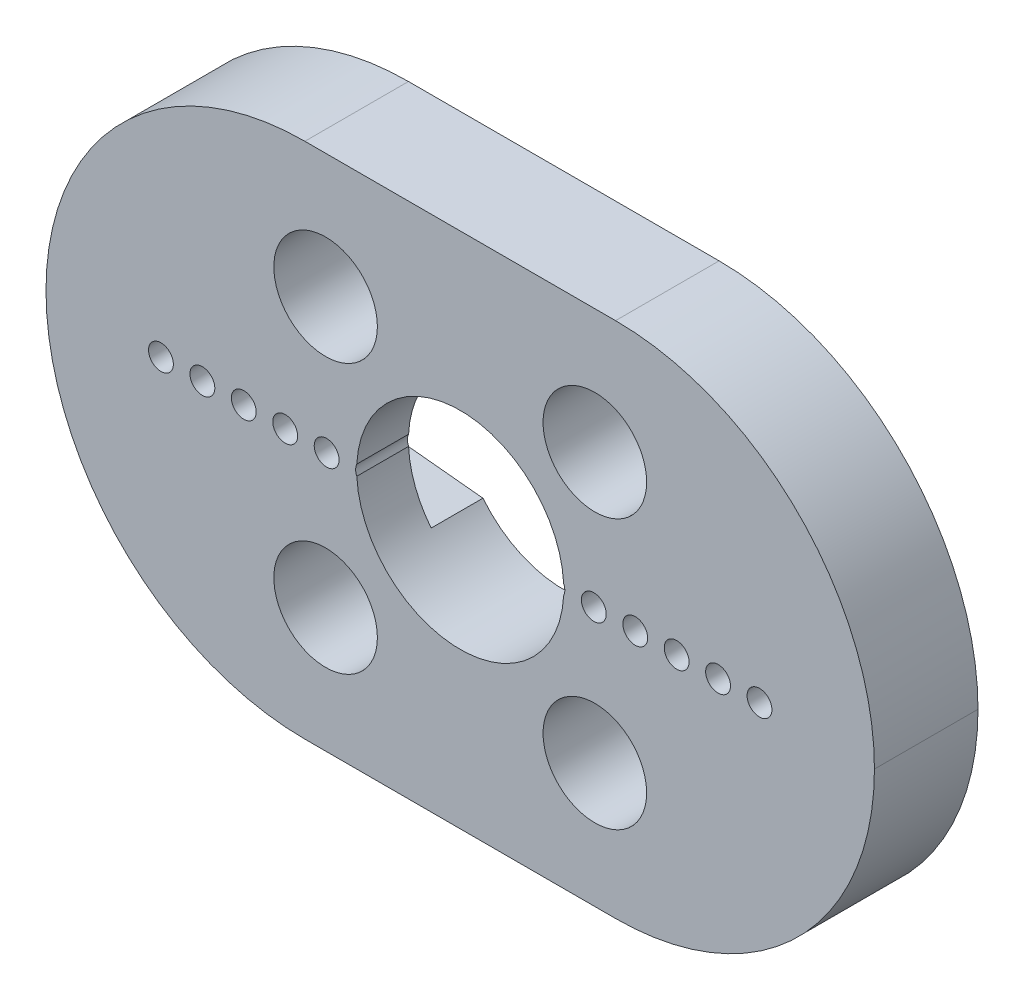
ISO-10303-21;
HEADER;
FILE_DESCRIPTION(('STEP AP214'),'2;1');
FILE_NAME('part.step','',(''),(''),'','','');
FILE_SCHEMA(('AUTOMOTIVE_DESIGN { 1 0 10303 214 1 1 1 1 }'));
ENDSEC;
DATA;
#1=APPLICATION_CONTEXT('core data for automotive mechanical design processes');
#2=APPLICATION_PROTOCOL_DEFINITION('international standard','automotive_design',2000,#1);
#3=PRODUCT_CONTEXT('',#1,'mechanical');
#4=PRODUCT('Part','Part','',(#3));
#5=PRODUCT_RELATED_PRODUCT_CATEGORY('part','',(#4));
#6=PRODUCT_DEFINITION_FORMATION('','',#4);
#7=PRODUCT_DEFINITION_CONTEXT('part definition',#1,'design');
#8=PRODUCT_DEFINITION('design','',#6,#7);
#9=PRODUCT_DEFINITION_SHAPE('','',#8);
#10=(LENGTH_UNIT() NAMED_UNIT(*) SI_UNIT(.MILLI.,.METRE.));
#11=(NAMED_UNIT(*) PLANE_ANGLE_UNIT() SI_UNIT($,.RADIAN.));
#12=(NAMED_UNIT(*) SI_UNIT($,.STERADIAN.) SOLID_ANGLE_UNIT());
#13=UNCERTAINTY_MEASURE_WITH_UNIT(LENGTH_MEASURE(1.E-05),#10,'distance_accuracy_value','');
#14=(GEOMETRIC_REPRESENTATION_CONTEXT(3) GLOBAL_UNCERTAINTY_ASSIGNED_CONTEXT((#13)) GLOBAL_UNIT_ASSIGNED_CONTEXT((#10,
#11,#12)) REPRESENTATION_CONTEXT('',''));
#15=CARTESIAN_POINT('',(0.,0.,0.));
#16=DIRECTION('',(0.,0.,1.));
#17=DIRECTION('',(1.,0.,0.));
#18=AXIS2_PLACEMENT_3D('',#15,#16,#17);
#19=CARTESIAN_POINT('',(0.,0.,2.5));
#20=DIRECTION('',(0.,0.,-1.));
#21=DIRECTION('',(-1.,0.,0.));
#22=AXIS2_PLACEMENT_3D('',#19,#20,#21);
#23=PLANE('',#22);
#24=CARTESIAN_POINT('',(0.,0.,2.5));
#25=DIRECTION('',(0.,0.,-1.));
#26=DIRECTION('',(-1.,0.,0.));
#27=AXIS2_PLACEMENT_3D('',#24,#25,#26);
#28=CIRCLE('',#27,5.);
#29=CARTESIAN_POINT('',(-4.9935393258427,0.254096440869342,2.5));
#30=VERTEX_POINT('',#29);
#31=CARTESIAN_POINT('',(-3.90281578469811,3.12538460844603,2.5));
#32=VERTEX_POINT('',#31);
#33=EDGE_CURVE('E189',#30,#32,#28,.T.);
#34=ORIENTED_EDGE('',*,*,#33,.F.);
#35=CARTESIAN_POINT('',(-4.45,0.,2.5));
#36=DIRECTION('',(0.,0.,-1.));
#37=DIRECTION('',(-1.,0.,0.));
#38=AXIS2_PLACEMENT_3D('',#35,#36,#37);
#39=CIRCLE('',#38,0.6);
#40=CARTESIAN_POINT('',(-4.9935393258427,-0.254096440869342,2.5));
#41=VERTEX_POINT('',#40);
#42=EDGE_CURVE('E188',#41,#30,#39,.T.);
#43=ORIENTED_EDGE('',*,*,#42,.F.);
#44=CARTESIAN_POINT('',(-3.90281578469811,-3.12538460844603,2.5));
#45=VERTEX_POINT('',#44);
#46=EDGE_CURVE('E555',#45,#41,#28,.T.);
#47=ORIENTED_EDGE('',*,*,#46,.F.);
#48=DIRECTION('',(0.99498743710662,-0.0999999999999999,0.));
#49=VECTOR('',#48,1.);
#50=CARTESIAN_POINT('',(-0.349999999999999,-3.48245602987317,2.5));
#51=LINE('',#50,#49);
#52=CARTESIAN_POINT('',(-15.2,-1.98997487421324,2.5));
#53=VERTEX_POINT('',#52);
#54=EDGE_CURVE('E217',#53,#45,#51,.T.);
#55=ORIENTED_EDGE('',*,*,#54,.F.);
#56=CARTESIAN_POINT('',(-15.,0.,2.5));
#57=DIRECTION('',(0.,0.,-1.));
#58=DIRECTION('',(-1.,0.,0.));
#59=AXIS2_PLACEMENT_3D('',#56,#57,#58);
#60=CIRCLE('',#59,2.);
#61=CARTESIAN_POINT('',(-15.2,1.98997487421324,2.5));
#62=VERTEX_POINT('',#61);
#63=EDGE_CURVE('E220',#53,#62,#60,.T.);
#64=ORIENTED_EDGE('',*,*,#63,.T.);
#65=DIRECTION('',(0.99498743710662,0.0999999999999999,0.));
#66=VECTOR('',#65,1.);
#67=CARTESIAN_POINT('',(-0.349999999999999,3.48245602987317,2.5));
#68=LINE('',#67,#66);
#69=EDGE_CURVE('E205',#62,#32,#68,.T.);
#70=ORIENTED_EDGE('',*,*,#69,.T.);
#71=EDGE_LOOP('',(#34,#43,#47,#55,#64,#70));
#72=FACE_BOUND('',#71,.T.);
#73=CARTESIAN_POINT('',(-8.45,0.,2.5));
#74=DIRECTION('',(0.,0.,-1.));
#75=DIRECTION('',(-1.,0.,0.));
#76=AXIS2_PLACEMENT_3D('',#73,#74,#75);
#77=CIRCLE('',#76,0.6);
#78=CARTESIAN_POINT('',(-9.05,0.,2.5));
#79=VERTEX_POINT('',#78);
#80=EDGE_CURVE('E417',#79,#79,#77,.T.);
#81=ORIENTED_EDGE('',*,*,#80,.F.);
#82=EDGE_LOOP('',(#81));
#83=FACE_BOUND('',#82,.T.);
#84=CARTESIAN_POINT('',(-10.45,0.,2.5));
#85=DIRECTION('',(0.,0.,-1.));
#86=DIRECTION('',(-1.,0.,0.));
#87=AXIS2_PLACEMENT_3D('',#84,#85,#86);
#88=CIRCLE('',#87,0.6);
#89=CARTESIAN_POINT('',(-11.05,0.,2.5));
#90=VERTEX_POINT('',#89);
#91=EDGE_CURVE('E202',#90,#90,#88,.T.);
#92=ORIENTED_EDGE('',*,*,#91,.F.);
#93=EDGE_LOOP('',(#92));
#94=FACE_BOUND('',#93,.T.);
#95=CARTESIAN_POINT('',(-12.45,0.,2.5));
#96=DIRECTION('',(0.,0.,-1.));
#97=DIRECTION('',(-1.,0.,0.));
#98=AXIS2_PLACEMENT_3D('',#95,#96,#97);
#99=CIRCLE('',#98,0.6);
#100=CARTESIAN_POINT('',(-13.05,0.,2.5));
#101=VERTEX_POINT('',#100);
#102=EDGE_CURVE('E387',#101,#101,#99,.T.);
#103=ORIENTED_EDGE('',*,*,#102,.F.);
#104=EDGE_LOOP('',(#103));
#105=FACE_BOUND('',#104,.T.);
#106=CARTESIAN_POINT('',(-14.45,0.,2.5));
#107=DIRECTION('',(0.,0.,-1.));
#108=DIRECTION('',(-1.,0.,0.));
#109=AXIS2_PLACEMENT_3D('',#106,#107,#108);
#110=CIRCLE('',#109,0.6);
#111=CARTESIAN_POINT('',(-15.05,0.,2.5));
#112=VERTEX_POINT('',#111);
#113=EDGE_CURVE('E393',#112,#112,#110,.T.);
#114=ORIENTED_EDGE('',*,*,#113,.F.);
#115=EDGE_LOOP('',(#114));
#116=FACE_BOUND('',#115,.T.);
#117=CARTESIAN_POINT('',(-6.45,0.,2.5));
#118=DIRECTION('',(0.,0.,-1.));
#119=DIRECTION('',(-1.,0.,0.));
#120=AXIS2_PLACEMENT_3D('',#117,#118,#119);
#121=CIRCLE('',#120,0.6);
#122=CARTESIAN_POINT('',(-7.05,0.,2.5));
#123=VERTEX_POINT('',#122);
#124=EDGE_CURVE('E411',#123,#123,#121,.T.);
#125=ORIENTED_EDGE('',*,*,#124,.F.);
#126=EDGE_LOOP('',(#125));
#127=FACE_BOUND('',#126,.T.);
#128=ADVANCED_FACE('F40',(#72,#83,#94,#105,#116,#127),#23,.T.);
#129=CARTESIAN_POINT('',(-20.,12.5,5.));
#130=DIRECTION('',(0.,-1.,0.));
#131=DIRECTION('',(0.,0.,-1.));
#132=AXIS2_PLACEMENT_3D('',#129,#130,#131);
#133=PLANE('',#132);
#134=DIRECTION('',(-1.,0.,0.));
#135=VECTOR('',#134,1.);
#136=CARTESIAN_POINT('',(-20.,12.5,0.));
#137=LINE('',#136,#135);
#138=CARTESIAN_POINT('',(7.5,12.5,0.));
#139=VERTEX_POINT('',#138);
#140=CARTESIAN_POINT('',(-7.5,12.5,0.));
#141=VERTEX_POINT('',#140);
#142=EDGE_CURVE('E239',#139,#141,#137,.T.);
#143=ORIENTED_EDGE('',*,*,#142,.T.);
#144=DIRECTION('',(0.,0.,-1.));
#145=VECTOR('',#144,1.);
#146=CARTESIAN_POINT('',(-7.5,12.5,5.));
#147=LINE('',#146,#145);
#148=CARTESIAN_POINT('',(-7.5,12.5,5.));
#149=VERTEX_POINT('',#148);
#150=EDGE_CURVE('E269',#141,#149,#147,.F.);
#151=ORIENTED_EDGE('',*,*,#150,.T.);
#152=DIRECTION('',(-1.,0.,0.));
#153=VECTOR('',#152,1.);
#154=CARTESIAN_POINT('',(-20.,12.5,5.));
#155=LINE('',#154,#153);
#156=CARTESIAN_POINT('',(7.5,12.5,5.));
#157=VERTEX_POINT('',#156);
#158=EDGE_CURVE('E245',#157,#149,#155,.T.);
#159=ORIENTED_EDGE('',*,*,#158,.F.);
#160=DIRECTION('',(0.,0.,-1.));
#161=VECTOR('',#160,1.);
#162=CARTESIAN_POINT('',(7.5,12.5,5.));
#163=LINE('',#162,#161);
#164=EDGE_CURVE('E267',#157,#139,#163,.T.);
#165=ORIENTED_EDGE('',*,*,#164,.T.);
#166=EDGE_LOOP('',(#143,#151,#159,#165));
#167=FACE_BOUND('',#166,.T.);
#168=ADVANCED_FACE('F296',(#167),#133,.F.);
#169=CARTESIAN_POINT('',(-20.,-12.5,5.));
#170=DIRECTION('',(0.,1.,0.));
#171=DIRECTION('',(0.,0.,1.));
#172=AXIS2_PLACEMENT_3D('',#169,#170,#171);
#173=PLANE('',#172);
#174=DIRECTION('',(1.,0.,0.));
#175=VECTOR('',#174,1.);
#176=CARTESIAN_POINT('',(-20.,-12.5,5.));
#177=LINE('',#176,#175);
#178=CARTESIAN_POINT('',(-7.5,-12.5,5.));
#179=VERTEX_POINT('',#178);
#180=CARTESIAN_POINT('',(7.5,-12.5,5.));
#181=VERTEX_POINT('',#180);
#182=EDGE_CURVE('E248',#179,#181,#177,.T.);
#183=ORIENTED_EDGE('',*,*,#182,.F.);
#184=DIRECTION('',(0.,0.,-1.));
#185=VECTOR('',#184,1.);
#186=CARTESIAN_POINT('',(-7.5,-12.5,5.));
#187=LINE('',#186,#185);
#188=CARTESIAN_POINT('',(-7.5,-12.5,0.));
#189=VERTEX_POINT('',#188);
#190=EDGE_CURVE('E11',#179,#189,#187,.T.);
#191=ORIENTED_EDGE('',*,*,#190,.T.);
#192=DIRECTION('',(1.,0.,0.));
#193=VECTOR('',#192,1.);
#194=CARTESIAN_POINT('',(-20.,-12.5,0.));
#195=LINE('',#194,#193);
#196=CARTESIAN_POINT('',(7.5,-12.5,0.));
#197=VERTEX_POINT('',#196);
#198=EDGE_CURVE('E249',#189,#197,#195,.T.);
#199=ORIENTED_EDGE('',*,*,#198,.T.);
#200=DIRECTION('',(0.,0.,-1.));
#201=VECTOR('',#200,1.);
#202=CARTESIAN_POINT('',(7.5,-12.5,5.));
#203=LINE('',#202,#201);
#204=EDGE_CURVE('E49',#197,#181,#203,.F.);
#205=ORIENTED_EDGE('',*,*,#204,.T.);
#206=EDGE_LOOP('',(#183,#191,#199,#205));
#207=FACE_BOUND('',#206,.T.);
#208=ADVANCED_FACE('F306',(#207),#173,.F.);
#209=CARTESIAN_POINT('',(0.,0.,5.));
#210=DIRECTION('',(0.,0.,-1.));
#211=DIRECTION('',(-1.,0.,0.));
#212=AXIS2_PLACEMENT_3D('',#209,#210,#211);
#213=PLANE('',#212);
#214=CARTESIAN_POINT('',(6.5,-6.5,5.));
#215=DIRECTION('',(0.,0.,1.));
#216=DIRECTION('',(1.,0.,0.));
#217=AXIS2_PLACEMENT_3D('',#214,#215,#216);
#218=CIRCLE('',#217,2.5);
#219=CARTESIAN_POINT('',(9.,-6.5,5.));
#220=VERTEX_POINT('',#219);
#221=EDGE_CURVE('E280',#220,#220,#218,.T.);
#222=ORIENTED_EDGE('',*,*,#221,.F.);
#223=EDGE_LOOP('',(#222));
#224=FACE_BOUND('',#223,.T.);
#225=CARTESIAN_POINT('',(-6.5,-6.5,5.));
#226=DIRECTION('',(0.,0.,1.));
#227=DIRECTION('',(1.,0.,0.));
#228=AXIS2_PLACEMENT_3D('',#225,#226,#227);
#229=CIRCLE('',#228,2.5);
#230=CARTESIAN_POINT('',(-4.,-6.5,5.));
#231=VERTEX_POINT('',#230);
#232=EDGE_CURVE('E539',#231,#231,#229,.T.);
#233=ORIENTED_EDGE('',*,*,#232,.F.);
#234=EDGE_LOOP('',(#233));
#235=FACE_BOUND('',#234,.T.);
#236=CARTESIAN_POINT('',(-6.5,6.5,5.));
#237=DIRECTION('',(0.,0.,1.));
#238=DIRECTION('',(1.,0.,0.));
#239=AXIS2_PLACEMENT_3D('',#236,#237,#238);
#240=CIRCLE('',#239,2.5);
#241=CARTESIAN_POINT('',(-4.,6.5,5.));
#242=VERTEX_POINT('',#241);
#243=EDGE_CURVE('E532',#242,#242,#240,.T.);
#244=ORIENTED_EDGE('',*,*,#243,.F.);
#245=EDGE_LOOP('',(#244));
#246=FACE_BOUND('',#245,.T.);
#247=CARTESIAN_POINT('',(6.5,6.5,5.));
#248=DIRECTION('',(0.,0.,1.));
#249=DIRECTION('',(1.,0.,0.));
#250=AXIS2_PLACEMENT_3D('',#247,#248,#249);
#251=CIRCLE('',#250,2.5);
#252=CARTESIAN_POINT('',(9.,6.5,5.));
#253=VERTEX_POINT('',#252);
#254=EDGE_CURVE('E536',#253,#253,#251,.T.);
#255=ORIENTED_EDGE('',*,*,#254,.F.);
#256=EDGE_LOOP('',(#255));
#257=FACE_BOUND('',#256,.T.);
#258=CARTESIAN_POINT('',(10.45,0.,5.));
#259=DIRECTION('',(0.,0.,-1.));
#260=DIRECTION('',(1.,0.,0.));
#261=AXIS2_PLACEMENT_3D('',#258,#259,#260);
#262=CIRCLE('',#261,0.6);
#263=CARTESIAN_POINT('',(11.05,0.,5.));
#264=VERTEX_POINT('',#263);
#265=EDGE_CURVE('E400',#264,#264,#262,.T.);
#266=ORIENTED_EDGE('',*,*,#265,.T.);
#267=EDGE_LOOP('',(#266));
#268=FACE_BOUND('',#267,.T.);
#269=CARTESIAN_POINT('',(12.45,0.,5.));
#270=DIRECTION('',(0.,0.,-1.));
#271=DIRECTION('',(1.,0.,0.));
#272=AXIS2_PLACEMENT_3D('',#269,#270,#271);
#273=CIRCLE('',#272,0.6);
#274=CARTESIAN_POINT('',(13.05,0.,5.));
#275=VERTEX_POINT('',#274);
#276=EDGE_CURVE('E396',#275,#275,#273,.T.);
#277=ORIENTED_EDGE('',*,*,#276,.T.);
#278=EDGE_LOOP('',(#277));
#279=FACE_BOUND('',#278,.T.);
#280=CARTESIAN_POINT('',(-14.45,0.,5.));
#281=DIRECTION('',(0.,0.,-1.));
#282=DIRECTION('',(-1.,0.,0.));
#283=AXIS2_PLACEMENT_3D('',#280,#281,#282);
#284=CIRCLE('',#283,0.6);
#285=CARTESIAN_POINT('',(-15.05,0.,5.));
#286=VERTEX_POINT('',#285);
#287=EDGE_CURVE('E390',#286,#286,#284,.T.);
#288=ORIENTED_EDGE('',*,*,#287,.T.);
#289=EDGE_LOOP('',(#288));
#290=FACE_BOUND('',#289,.T.);
#291=CARTESIAN_POINT('',(-12.45,0.,5.));
#292=DIRECTION('',(0.,0.,-1.));
#293=DIRECTION('',(-1.,0.,0.));
#294=AXIS2_PLACEMENT_3D('',#291,#292,#293);
#295=CIRCLE('',#294,0.6);
#296=CARTESIAN_POINT('',(-13.05,0.,5.));
#297=VERTEX_POINT('',#296);
#298=EDGE_CURVE('E384',#297,#297,#295,.T.);
#299=ORIENTED_EDGE('',*,*,#298,.T.);
#300=EDGE_LOOP('',(#299));
#301=FACE_BOUND('',#300,.T.);
#302=CARTESIAN_POINT('',(-10.45,0.,5.));
#303=DIRECTION('',(0.,0.,-1.));
#304=DIRECTION('',(-1.,0.,0.));
#305=AXIS2_PLACEMENT_3D('',#302,#303,#304);
#306=CIRCLE('',#305,0.6);
#307=CARTESIAN_POINT('',(-11.05,0.,5.));
#308=VERTEX_POINT('',#307);
#309=EDGE_CURVE('E419',#308,#308,#306,.T.);
#310=ORIENTED_EDGE('',*,*,#309,.T.);
#311=EDGE_LOOP('',(#310));
#312=FACE_BOUND('',#311,.T.);
#313=CARTESIAN_POINT('',(-8.45,0.,5.));
#314=DIRECTION('',(0.,0.,-1.));
#315=DIRECTION('',(-1.,0.,0.));
#316=AXIS2_PLACEMENT_3D('',#313,#314,#315);
#317=CIRCLE('',#316,0.6);
#318=CARTESIAN_POINT('',(-9.05,0.,5.));
#319=VERTEX_POINT('',#318);
#320=EDGE_CURVE('E414',#319,#319,#317,.T.);
#321=ORIENTED_EDGE('',*,*,#320,.T.);
#322=EDGE_LOOP('',(#321));
#323=FACE_BOUND('',#322,.T.);
#324=CARTESIAN_POINT('',(-6.45,0.,5.));
#325=DIRECTION('',(0.,0.,-1.));
#326=DIRECTION('',(-1.,0.,0.));
#327=AXIS2_PLACEMENT_3D('',#324,#325,#326);
#328=CIRCLE('',#327,0.6);
#329=CARTESIAN_POINT('',(-7.05,0.,5.));
#330=VERTEX_POINT('',#329);
#331=EDGE_CURVE('E408',#330,#330,#328,.T.);
#332=ORIENTED_EDGE('',*,*,#331,.T.);
#333=EDGE_LOOP('',(#332));
#334=FACE_BOUND('',#333,.T.);
#335=CARTESIAN_POINT('',(14.45,0.,5.));
#336=DIRECTION('',(0.,0.,-1.));
#337=DIRECTION('',(1.,0.,0.));
#338=AXIS2_PLACEMENT_3D('',#335,#336,#337);
#339=CIRCLE('',#338,0.6);
#340=CARTESIAN_POINT('',(15.05,0.,5.));
#341=VERTEX_POINT('',#340);
#342=EDGE_CURVE('E199',#341,#341,#339,.T.);
#343=ORIENTED_EDGE('',*,*,#342,.T.);
#344=EDGE_LOOP('',(#343));
#345=FACE_BOUND('',#344,.T.);
#346=CARTESIAN_POINT('',(8.45,0.,5.));
#347=DIRECTION('',(0.,0.,-1.));
#348=DIRECTION('',(1.,0.,0.));
#349=AXIS2_PLACEMENT_3D('',#346,#347,#348);
#350=CIRCLE('',#349,0.6);
#351=CARTESIAN_POINT('',(9.05,0.,5.));
#352=VERTEX_POINT('',#351);
#353=EDGE_CURVE('E404',#352,#352,#350,.T.);
#354=ORIENTED_EDGE('',*,*,#353,.T.);
#355=EDGE_LOOP('',(#354));
#356=FACE_BOUND('',#355,.T.);
#357=CARTESIAN_POINT('',(6.45,0.,5.));
#358=DIRECTION('',(0.,0.,-1.));
#359=DIRECTION('',(1.,0.,0.));
#360=AXIS2_PLACEMENT_3D('',#357,#358,#359);
#361=CIRCLE('',#360,0.6);
#362=CARTESIAN_POINT('',(7.05,0.,5.));
#363=VERTEX_POINT('',#362);
#364=EDGE_CURVE('E372',#363,#363,#361,.T.);
#365=ORIENTED_EDGE('',*,*,#364,.T.);
#366=EDGE_LOOP('',(#365));
#367=FACE_BOUND('',#366,.T.);
#368=CARTESIAN_POINT('',(-4.45,0.,5.));
#369=DIRECTION('',(0.,0.,-1.));
#370=DIRECTION('',(-1.,0.,0.));
#371=AXIS2_PLACEMENT_3D('',#368,#369,#370);
#372=CIRCLE('',#371,0.6);
#373=CARTESIAN_POINT('',(-4.9935393258427,-0.254096440869346,5.));
#374=VERTEX_POINT('',#373);
#375=CARTESIAN_POINT('',(-4.9935393258427,0.254096440869346,5.));
#376=VERTEX_POINT('',#375);
#377=EDGE_CURVE('E186',#374,#376,#372,.T.);
#378=ORIENTED_EDGE('',*,*,#377,.T.);
#379=CARTESIAN_POINT('',(0.,0.,5.));
#380=DIRECTION('',(0.,0.,-1.));
#381=DIRECTION('',(-1.,0.,0.));
#382=AXIS2_PLACEMENT_3D('',#379,#380,#381);
#383=CIRCLE('',#382,5.);
#384=CARTESIAN_POINT('',(4.9935393258427,0.254096440869346,5.));
#385=VERTEX_POINT('',#384);
#386=EDGE_CURVE('E167',#376,#385,#383,.T.);
#387=ORIENTED_EDGE('',*,*,#386,.T.);
#388=CARTESIAN_POINT('',(4.45,0.,5.));
#389=DIRECTION('',(0.,0.,-1.));
#390=DIRECTION('',(1.,0.,0.));
#391=AXIS2_PLACEMENT_3D('',#388,#389,#390);
#392=CIRCLE('',#391,0.6);
#393=CARTESIAN_POINT('',(4.9935393258427,-0.254096440869345,5.));
#394=VERTEX_POINT('',#393);
#395=EDGE_CURVE('E373',#385,#394,#392,.T.);
#396=ORIENTED_EDGE('',*,*,#395,.T.);
#397=EDGE_CURVE('E179',#394,#374,#383,.T.);
#398=ORIENTED_EDGE('',*,*,#397,.T.);
#399=EDGE_LOOP('',(#378,#387,#396,#398));
#400=FACE_BOUND('',#399,.T.);
#401=ORIENTED_EDGE('',*,*,#158,.T.);
#402=CARTESIAN_POINT('',(-7.5,0.,5.));
#403=DIRECTION('',(0.,0.,-1.));
#404=DIRECTION('',(-1.,0.,0.));
#405=AXIS2_PLACEMENT_3D('',#402,#403,#404);
#406=CIRCLE('',#405,12.5);
#407=CARTESIAN_POINT('',(-20.,0.,5.));
#408=VERTEX_POINT('',#407);
#409=EDGE_CURVE('E276',#149,#408,#406,.F.);
#410=ORIENTED_EDGE('',*,*,#409,.T.);
#411=CARTESIAN_POINT('',(-7.5,0.,5.));
#412=DIRECTION('',(0.,0.,-1.));
#413=DIRECTION('',(-1.,0.,0.));
#414=AXIS2_PLACEMENT_3D('',#411,#412,#413);
#415=CIRCLE('',#414,12.5);
#416=EDGE_CURVE('E65',#408,#179,#415,.F.);
#417=ORIENTED_EDGE('',*,*,#416,.T.);
#418=ORIENTED_EDGE('',*,*,#182,.T.);
#419=CARTESIAN_POINT('',(7.5,0.,5.));
#420=DIRECTION('',(0.,0.,-1.));
#421=DIRECTION('',(-1.,0.,0.));
#422=AXIS2_PLACEMENT_3D('',#419,#420,#421);
#423=CIRCLE('',#422,12.5);
#424=CARTESIAN_POINT('',(20.,0.,5.));
#425=VERTEX_POINT('',#424);
#426=EDGE_CURVE('E57',#181,#425,#423,.F.);
#427=ORIENTED_EDGE('',*,*,#426,.T.);
#428=CARTESIAN_POINT('',(7.5,0.,5.));
#429=DIRECTION('',(0.,0.,-1.));
#430=DIRECTION('',(-1.,0.,0.));
#431=AXIS2_PLACEMENT_3D('',#428,#429,#430);
#432=CIRCLE('',#431,12.5);
#433=EDGE_CURVE('E272',#425,#157,#432,.F.);
#434=ORIENTED_EDGE('',*,*,#433,.T.);
#435=EDGE_LOOP('',(#401,#410,#417,#418,#427,#434));
#436=FACE_BOUND('',#435,.T.);
#437=ADVANCED_FACE('F193',(#224,#235,#246,#257,#268,#279,#290,#301,#312,#323,#334,#345,#356,
#367,#400,#436),#213,.F.);
#438=CARTESIAN_POINT('',(0.,0.,0.));
#439=DIRECTION('',(0.,0.,-1.));
#440=DIRECTION('',(-1.,0.,0.));
#441=AXIS2_PLACEMENT_3D('',#438,#439,#440);
#442=PLANE('',#441);
#443=CARTESIAN_POINT('',(6.5,-6.5,0.));
#444=DIRECTION('',(0.,0.,1.));
#445=DIRECTION('',(1.,0.,0.));
#446=AXIS2_PLACEMENT_3D('',#443,#444,#445);
#447=CIRCLE('',#446,2.5);
#448=CARTESIAN_POINT('',(9.,-6.5,0.));
#449=VERTEX_POINT('',#448);
#450=EDGE_CURVE('E285',#449,#449,#447,.T.);
#451=ORIENTED_EDGE('',*,*,#450,.T.);
#452=EDGE_LOOP('',(#451));
#453=FACE_BOUND('',#452,.T.);
#454=CARTESIAN_POINT('',(-6.5,-6.5,0.));
#455=DIRECTION('',(0.,0.,1.));
#456=DIRECTION('',(1.,0.,0.));
#457=AXIS2_PLACEMENT_3D('',#454,#455,#456);
#458=CIRCLE('',#457,2.5);
#459=CARTESIAN_POINT('',(-4.,-6.5,0.));
#460=VERTEX_POINT('',#459);
#461=EDGE_CURVE('E534',#460,#460,#458,.T.);
#462=ORIENTED_EDGE('',*,*,#461,.T.);
#463=EDGE_LOOP('',(#462));
#464=FACE_BOUND('',#463,.T.);
#465=CARTESIAN_POINT('',(-6.5,6.5,0.));
#466=DIRECTION('',(0.,0.,1.));
#467=DIRECTION('',(1.,0.,0.));
#468=AXIS2_PLACEMENT_3D('',#465,#466,#467);
#469=CIRCLE('',#468,2.5);
#470=CARTESIAN_POINT('',(-4.,6.5,0.));
#471=VERTEX_POINT('',#470);
#472=EDGE_CURVE('E529',#471,#471,#469,.T.);
#473=ORIENTED_EDGE('',*,*,#472,.T.);
#474=EDGE_LOOP('',(#473));
#475=FACE_BOUND('',#474,.T.);
#476=CARTESIAN_POINT('',(6.5,6.5,0.));
#477=DIRECTION('',(0.,0.,1.));
#478=DIRECTION('',(1.,0.,0.));
#479=AXIS2_PLACEMENT_3D('',#476,#477,#478);
#480=CIRCLE('',#479,2.5);
#481=CARTESIAN_POINT('',(9.,6.5,0.));
#482=VERTEX_POINT('',#481);
#483=EDGE_CURVE('E545',#482,#482,#480,.T.);
#484=ORIENTED_EDGE('',*,*,#483,.T.);
#485=EDGE_LOOP('',(#484));
#486=FACE_BOUND('',#485,.T.);
#487=CARTESIAN_POINT('',(0.,0.,0.));
#488=DIRECTION('',(0.,0.,-1.));
#489=DIRECTION('',(-1.,0.,0.));
#490=AXIS2_PLACEMENT_3D('',#487,#488,#489);
#491=CIRCLE('',#490,5.);
#492=CARTESIAN_POINT('',(-3.90281578469811,3.12538460844603,0.));
#493=VERTEX_POINT('',#492);
#494=CARTESIAN_POINT('',(3.90281578469811,3.12538460844603,0.));
#495=VERTEX_POINT('',#494);
#496=EDGE_CURVE('E551',#493,#495,#491,.T.);
#497=ORIENTED_EDGE('',*,*,#496,.F.);
#498=DIRECTION('',(0.99498743710662,0.0999999999999999,0.));
#499=VECTOR('',#498,1.);
#500=CARTESIAN_POINT('',(-0.349999999999999,3.48245602987317,0.));
#501=LINE('',#500,#499);
#502=CARTESIAN_POINT('',(-15.2,1.98997487421324,0.));
#503=VERTEX_POINT('',#502);
#504=EDGE_CURVE('E194',#503,#493,#501,.T.);
#505=ORIENTED_EDGE('',*,*,#504,.F.);
#506=CARTESIAN_POINT('',(-15.,0.,0.));
#507=DIRECTION('',(0.,0.,-1.));
#508=DIRECTION('',(-1.,0.,0.));
#509=AXIS2_PLACEMENT_3D('',#506,#507,#508);
#510=CIRCLE('',#509,2.);
#511=CARTESIAN_POINT('',(-15.2,-1.98997487421324,0.));
#512=VERTEX_POINT('',#511);
#513=EDGE_CURVE('E209',#512,#503,#510,.T.);
#514=ORIENTED_EDGE('',*,*,#513,.F.);
#515=DIRECTION('',(0.99498743710662,-0.0999999999999999,0.));
#516=VECTOR('',#515,1.);
#517=CARTESIAN_POINT('',(-0.349999999999999,-3.48245602987317,0.));
#518=LINE('',#517,#516);
#519=CARTESIAN_POINT('',(-3.90281578469811,-3.12538460844603,0.));
#520=VERTEX_POINT('',#519);
#521=EDGE_CURVE('E232',#512,#520,#518,.T.);
#522=ORIENTED_EDGE('',*,*,#521,.T.);
#523=CARTESIAN_POINT('',(3.90281578469811,-3.12538460844603,0.));
#524=VERTEX_POINT('',#523);
#525=EDGE_CURVE('E548',#524,#520,#491,.T.);
#526=ORIENTED_EDGE('',*,*,#525,.F.);
#527=DIRECTION('',(-0.99498743710662,-0.0999999999999999,0.));
#528=VECTOR('',#527,1.);
#529=CARTESIAN_POINT('',(0.349999999999999,-3.48245602987317,0.));
#530=LINE('',#529,#528);
#531=CARTESIAN_POINT('',(15.2,-1.98997487421324,0.));
#532=VERTEX_POINT('',#531);
#533=EDGE_CURVE('E229',#532,#524,#530,.T.);
#534=ORIENTED_EDGE('',*,*,#533,.F.);
#535=CARTESIAN_POINT('',(15.,0.,0.));
#536=DIRECTION('',(0.,0.,-1.));
#537=DIRECTION('',(-1.,0.,0.));
#538=AXIS2_PLACEMENT_3D('',#535,#536,#537);
#539=CIRCLE('',#538,2.);
#540=CARTESIAN_POINT('',(15.2,1.98997487421324,0.));
#541=VERTEX_POINT('',#540);
#542=EDGE_CURVE('E226',#532,#541,#539,.F.);
#543=ORIENTED_EDGE('',*,*,#542,.T.);
#544=DIRECTION('',(-0.99498743710662,0.0999999999999999,0.));
#545=VECTOR('',#544,1.);
#546=CARTESIAN_POINT('',(0.349999999999999,3.48245602987317,0.));
#547=LINE('',#546,#545);
#548=EDGE_CURVE('E197',#541,#495,#547,.T.);
#549=ORIENTED_EDGE('',*,*,#548,.T.);
#550=EDGE_LOOP('',(#497,#505,#514,#522,#526,#534,#543,#549));
#551=FACE_BOUND('',#550,.T.);
#552=CARTESIAN_POINT('',(-7.5,0.,0.));
#553=DIRECTION('',(0.,0.,-1.));
#554=DIRECTION('',(-1.,0.,0.));
#555=AXIS2_PLACEMENT_3D('',#552,#553,#554);
#556=CIRCLE('',#555,12.5);
#557=CARTESIAN_POINT('',(-20.,0.,0.));
#558=VERTEX_POINT('',#557);
#559=EDGE_CURVE('E263',#189,#558,#556,.T.);
#560=ORIENTED_EDGE('',*,*,#559,.T.);
#561=CARTESIAN_POINT('',(-7.5,0.,0.));
#562=DIRECTION('',(0.,0.,-1.));
#563=DIRECTION('',(-1.,0.,0.));
#564=AXIS2_PLACEMENT_3D('',#561,#562,#563);
#565=CIRCLE('',#564,12.5);
#566=EDGE_CURVE('E265',#558,#141,#565,.T.);
#567=ORIENTED_EDGE('',*,*,#566,.T.);
#568=ORIENTED_EDGE('',*,*,#142,.F.);
#569=CARTESIAN_POINT('',(7.5,0.,0.));
#570=DIRECTION('',(0.,0.,-1.));
#571=DIRECTION('',(-1.,0.,0.));
#572=AXIS2_PLACEMENT_3D('',#569,#570,#571);
#573=CIRCLE('',#572,12.5);
#574=CARTESIAN_POINT('',(20.,0.,0.));
#575=VERTEX_POINT('',#574);
#576=EDGE_CURVE('E259',#139,#575,#573,.T.);
#577=ORIENTED_EDGE('',*,*,#576,.T.);
#578=CARTESIAN_POINT('',(7.5,0.,0.));
#579=DIRECTION('',(0.,0.,-1.));
#580=DIRECTION('',(-1.,0.,0.));
#581=AXIS2_PLACEMENT_3D('',#578,#579,#580);
#582=CIRCLE('',#581,12.5);
#583=EDGE_CURVE('E261',#575,#197,#582,.T.);
#584=ORIENTED_EDGE('',*,*,#583,.T.);
#585=ORIENTED_EDGE('',*,*,#198,.F.);
#586=EDGE_LOOP('',(#560,#567,#568,#577,#584,#585));
#587=FACE_BOUND('',#586,.T.);
#588=ADVANCED_FACE('F308',(#453,#464,#475,#486,#551,#587),#442,.T.);
#589=CARTESIAN_POINT('',(-0.349999999999999,3.48245602987317,2.5));
#590=DIRECTION('',(-0.0999999999999999,0.99498743710662,0.));
#591=DIRECTION('',(-0.99498743710662,-0.0999999999999999,0.));
#592=AXIS2_PLACEMENT_3D('',#589,#590,#591);
#593=PLANE('',#592);
#594=ORIENTED_EDGE('',*,*,#504,.T.);
#595=DIRECTION('',(0.,0.,-1.));
#596=VECTOR('',#595,1.);
#597=CARTESIAN_POINT('',(-3.90281578469811,3.12538460844603,5.));
#598=LINE('',#597,#596);
#599=EDGE_CURVE('E559',#493,#32,#598,.F.);
#600=ORIENTED_EDGE('',*,*,#599,.T.);
#601=ORIENTED_EDGE('',*,*,#69,.F.);
#602=DIRECTION('',(0.,0.,-1.));
#603=VECTOR('',#602,1.);
#604=CARTESIAN_POINT('',(-15.2,1.98997487421324,2.5));
#605=LINE('',#604,#603);
#606=EDGE_CURVE('E237',#62,#503,#605,.T.);
#607=ORIENTED_EDGE('',*,*,#606,.T.);
#608=EDGE_LOOP('',(#594,#600,#601,#607));
#609=FACE_BOUND('',#608,.T.);
#610=ADVANCED_FACE('F310',(#609),#593,.F.);
#611=CARTESIAN_POINT('',(-15.,0.,2.5));
#612=DIRECTION('',(0.,0.,-1.));
#613=DIRECTION('',(-1.,0.,0.));
#614=AXIS2_PLACEMENT_3D('',#611,#612,#613);
#615=CYLINDRICAL_SURFACE('',#614,2.);
#616=ORIENTED_EDGE('',*,*,#513,.T.);
#617=ORIENTED_EDGE('',*,*,#606,.F.);
#618=ORIENTED_EDGE('',*,*,#63,.F.);
#619=DIRECTION('',(0.,0.,-1.));
#620=VECTOR('',#619,1.);
#621=CARTESIAN_POINT('',(-15.2,-1.98997487421324,2.5));
#622=LINE('',#621,#620);
#623=EDGE_CURVE('E240',#53,#512,#622,.T.);
#624=ORIENTED_EDGE('',*,*,#623,.T.);
#625=EDGE_LOOP('',(#616,#617,#618,#624));
#626=FACE_BOUND('',#625,.T.);
#627=ADVANCED_FACE('F317',(#626),#615,.F.);
#628=CARTESIAN_POINT('',(-0.349999999999999,-3.48245602987317,2.5));
#629=DIRECTION('',(0.0999999999999999,0.99498743710662,0.));
#630=DIRECTION('',(-0.99498743710662,0.0999999999999999,0.));
#631=AXIS2_PLACEMENT_3D('',#628,#629,#630);
#632=PLANE('',#631);
#633=DIRECTION('',(0.,0.,-1.));
#634=VECTOR('',#633,1.);
#635=CARTESIAN_POINT('',(-3.90281578469811,-3.12538460844603,5.));
#636=LINE('',#635,#634);
#637=EDGE_CURVE('E383',#520,#45,#636,.F.);
#638=ORIENTED_EDGE('',*,*,#637,.F.);
#639=ORIENTED_EDGE('',*,*,#521,.F.);
#640=ORIENTED_EDGE('',*,*,#623,.F.);
#641=ORIENTED_EDGE('',*,*,#54,.T.);
#642=EDGE_LOOP('',(#638,#639,#640,#641));
#643=FACE_BOUND('',#642,.T.);
#644=ADVANCED_FACE('F582',(#643),#632,.T.);
#645=CARTESIAN_POINT('',(0.349999999999999,-3.48245602987317,2.5));
#646=DIRECTION('',(0.0999999999999999,-0.99498743710662,0.));
#647=DIRECTION('',(0.99498743710662,0.0999999999999999,0.));
#648=AXIS2_PLACEMENT_3D('',#645,#646,#647);
#649=PLANE('',#648);
#650=ORIENTED_EDGE('',*,*,#533,.T.);
#651=DIRECTION('',(0.,0.,-1.));
#652=VECTOR('',#651,1.);
#653=CARTESIAN_POINT('',(3.90281578469811,-3.12538460844603,5.));
#654=LINE('',#653,#652);
#655=CARTESIAN_POINT('',(3.90281578469811,-3.12538460844603,2.5));
#656=VERTEX_POINT('',#655);
#657=EDGE_CURVE('E554',#524,#656,#654,.F.);
#658=ORIENTED_EDGE('',*,*,#657,.T.);
#659=DIRECTION('',(-0.99498743710662,-0.0999999999999999,0.));
#660=VECTOR('',#659,1.);
#661=CARTESIAN_POINT('',(0.349999999999999,-3.48245602987317,2.5));
#662=LINE('',#661,#660);
#663=CARTESIAN_POINT('',(15.2,-1.98997487421324,2.5));
#664=VERTEX_POINT('',#663);
#665=EDGE_CURVE('E214',#664,#656,#662,.T.);
#666=ORIENTED_EDGE('',*,*,#665,.F.);
#667=DIRECTION('',(0.,0.,-1.));
#668=VECTOR('',#667,1.);
#669=CARTESIAN_POINT('',(15.2,-1.98997487421324,2.5));
#670=LINE('',#669,#668);
#671=EDGE_CURVE('E242',#664,#532,#670,.T.);
#672=ORIENTED_EDGE('',*,*,#671,.T.);
#673=EDGE_LOOP('',(#650,#658,#666,#672));
#674=FACE_BOUND('',#673,.T.);
#675=ADVANCED_FACE('F574',(#674),#649,.F.);
#676=CARTESIAN_POINT('',(15.,0.,2.5));
#677=DIRECTION('',(0.,0.,-1.));
#678=DIRECTION('',(-1.,0.,0.));
#679=AXIS2_PLACEMENT_3D('',#676,#677,#678);
#680=CYLINDRICAL_SURFACE('',#679,2.);
#681=ORIENTED_EDGE('',*,*,#542,.F.);
#682=ORIENTED_EDGE('',*,*,#671,.F.);
#683=CARTESIAN_POINT('',(15.,0.,2.5));
#684=DIRECTION('',(0.,0.,-1.));
#685=DIRECTION('',(-1.,0.,0.));
#686=AXIS2_PLACEMENT_3D('',#683,#684,#685);
#687=CIRCLE('',#686,2.);
#688=CARTESIAN_POINT('',(15.2,1.98997487421324,2.5));
#689=VERTEX_POINT('',#688);
#690=EDGE_CURVE('E212',#664,#689,#687,.F.);
#691=ORIENTED_EDGE('',*,*,#690,.T.);
#692=DIRECTION('',(0.,0.,-1.));
#693=VECTOR('',#692,1.);
#694=CARTESIAN_POINT('',(15.2,1.98997487421324,2.5));
#695=LINE('',#694,#693);
#696=EDGE_CURVE('E222',#689,#541,#695,.T.);
#697=ORIENTED_EDGE('',*,*,#696,.T.);
#698=EDGE_LOOP('',(#681,#682,#691,#697));
#699=FACE_BOUND('',#698,.T.);
#700=ADVANCED_FACE('F344',(#699),#680,.F.);
#701=CARTESIAN_POINT('',(0.349999999999999,3.48245602987317,2.5));
#702=DIRECTION('',(-0.0999999999999999,-0.99498743710662,0.));
#703=DIRECTION('',(0.99498743710662,-0.0999999999999999,0.));
#704=AXIS2_PLACEMENT_3D('',#701,#702,#703);
#705=PLANE('',#704);
#706=DIRECTION('',(0.,0.,-1.));
#707=VECTOR('',#706,1.);
#708=CARTESIAN_POINT('',(3.90281578469811,3.12538460844603,5.));
#709=LINE('',#708,#707);
#710=CARTESIAN_POINT('',(3.90281578469811,3.12538460844603,2.5));
#711=VERTEX_POINT('',#710);
#712=EDGE_CURVE('E190',#495,#711,#709,.F.);
#713=ORIENTED_EDGE('',*,*,#712,.F.);
#714=ORIENTED_EDGE('',*,*,#548,.F.);
#715=ORIENTED_EDGE('',*,*,#696,.F.);
#716=DIRECTION('',(-0.99498743710662,0.0999999999999999,0.));
#717=VECTOR('',#716,1.);
#718=CARTESIAN_POINT('',(0.349999999999999,3.48245602987317,2.5));
#719=LINE('',#718,#717);
#720=EDGE_CURVE('E208',#689,#711,#719,.T.);
#721=ORIENTED_EDGE('',*,*,#720,.T.);
#722=EDGE_LOOP('',(#713,#714,#715,#721));
#723=FACE_BOUND('',#722,.T.);
#724=ADVANCED_FACE('F337',(#723),#705,.T.);
#725=CARTESIAN_POINT('',(4.9935393258427,0.254096440869342,2.5));
#726=VERTEX_POINT('',#725);
#727=EDGE_CURVE('E351',#711,#726,#28,.T.);
#728=ORIENTED_EDGE('',*,*,#727,.F.);
#729=ORIENTED_EDGE('',*,*,#720,.F.);
#730=ORIENTED_EDGE('',*,*,#690,.F.);
#731=ORIENTED_EDGE('',*,*,#665,.T.);
#732=CARTESIAN_POINT('',(4.9935393258427,-0.254096440869341,2.5));
#733=VERTEX_POINT('',#732);
#734=EDGE_CURVE('E178',#733,#656,#28,.T.);
#735=ORIENTED_EDGE('',*,*,#734,.F.);
#736=CARTESIAN_POINT('',(4.45,0.,2.5));
#737=DIRECTION('',(0.,0.,-1.));
#738=DIRECTION('',(1.,0.,0.));
#739=AXIS2_PLACEMENT_3D('',#736,#737,#738);
#740=CIRCLE('',#739,0.6);
#741=EDGE_CURVE('E377',#726,#733,#740,.T.);
#742=ORIENTED_EDGE('',*,*,#741,.F.);
#743=EDGE_LOOP('',(#728,#729,#730,#731,#735,#742));
#744=FACE_BOUND('',#743,.T.);
#745=CARTESIAN_POINT('',(10.45,0.,2.5));
#746=DIRECTION('',(0.,0.,-1.));
#747=DIRECTION('',(1.,0.,0.));
#748=AXIS2_PLACEMENT_3D('',#745,#746,#747);
#749=CIRCLE('',#748,0.6);
#750=CARTESIAN_POINT('',(11.05,0.,2.5));
#751=VERTEX_POINT('',#750);
#752=EDGE_CURVE('E355',#751,#751,#749,.T.);
#753=ORIENTED_EDGE('',*,*,#752,.F.);
#754=EDGE_LOOP('',(#753));
#755=FACE_BOUND('',#754,.T.);
#756=CARTESIAN_POINT('',(12.45,0.,2.5));
#757=DIRECTION('',(0.,0.,-1.));
#758=DIRECTION('',(1.,0.,0.));
#759=AXIS2_PLACEMENT_3D('',#756,#757,#758);
#760=CIRCLE('',#759,0.6);
#761=CARTESIAN_POINT('',(13.05,0.,2.5));
#762=VERTEX_POINT('',#761);
#763=EDGE_CURVE('E359',#762,#762,#760,.T.);
#764=ORIENTED_EDGE('',*,*,#763,.F.);
#765=EDGE_LOOP('',(#764));
#766=FACE_BOUND('',#765,.T.);
#767=CARTESIAN_POINT('',(14.45,0.,2.5));
#768=DIRECTION('',(0.,0.,-1.));
#769=DIRECTION('',(1.,0.,0.));
#770=AXIS2_PLACEMENT_3D('',#767,#768,#769);
#771=CIRCLE('',#770,0.6);
#772=CARTESIAN_POINT('',(15.05,0.,2.5));
#773=VERTEX_POINT('',#772);
#774=EDGE_CURVE('E363',#773,#773,#771,.T.);
#775=ORIENTED_EDGE('',*,*,#774,.F.);
#776=EDGE_LOOP('',(#775));
#777=FACE_BOUND('',#776,.T.);
#778=CARTESIAN_POINT('',(8.45,0.,2.5));
#779=DIRECTION('',(0.,0.,-1.));
#780=DIRECTION('',(1.,0.,0.));
#781=AXIS2_PLACEMENT_3D('',#778,#779,#780);
#782=CIRCLE('',#781,0.6);
#783=CARTESIAN_POINT('',(9.05,0.,2.5));
#784=VERTEX_POINT('',#783);
#785=EDGE_CURVE('E367',#784,#784,#782,.T.);
#786=ORIENTED_EDGE('',*,*,#785,.F.);
#787=EDGE_LOOP('',(#786));
#788=FACE_BOUND('',#787,.T.);
#789=CARTESIAN_POINT('',(6.45,0.,2.5));
#790=DIRECTION('',(0.,0.,-1.));
#791=DIRECTION('',(1.,0.,0.));
#792=AXIS2_PLACEMENT_3D('',#789,#790,#791);
#793=CIRCLE('',#792,0.6);
#794=CARTESIAN_POINT('',(7.05,0.,2.5));
#795=VERTEX_POINT('',#794);
#796=EDGE_CURVE('E370',#795,#795,#793,.T.);
#797=ORIENTED_EDGE('',*,*,#796,.F.);
#798=EDGE_LOOP('',(#797));
#799=FACE_BOUND('',#798,.T.);
#800=ADVANCED_FACE('F328',(#744,#755,#766,#777,#788,#799),#23,.T.);
#801=CARTESIAN_POINT('',(-4.45,0.,5.));
#802=DIRECTION('',(0.,0.,-1.));
#803=DIRECTION('',(-1.,0.,0.));
#804=AXIS2_PLACEMENT_3D('',#801,#802,#803);
#805=CYLINDRICAL_SURFACE('',#804,0.6);
#806=ORIENTED_EDGE('',*,*,#377,.F.);
#807=DIRECTION('',(0.,0.,-1.));
#808=VECTOR('',#807,1.);
#809=CARTESIAN_POINT('',(-4.9935393258427,-0.254096440869341,2.5));
#810=LINE('',#809,#808);
#811=EDGE_CURVE('E562',#374,#41,#810,.T.);
#812=ORIENTED_EDGE('',*,*,#811,.T.);
#813=ORIENTED_EDGE('',*,*,#42,.T.);
#814=DIRECTION('',(0.,0.,-1.));
#815=VECTOR('',#814,1.);
#816=CARTESIAN_POINT('',(-4.9935393258427,0.254096440869341,2.5));
#817=LINE('',#816,#815);
#818=EDGE_CURVE('E170',#30,#376,#817,.F.);
#819=ORIENTED_EDGE('',*,*,#818,.T.);
#820=EDGE_LOOP('',(#806,#812,#813,#819));
#821=FACE_BOUND('',#820,.T.);
#822=ADVANCED_FACE('F184',(#821),#805,.F.);
#823=CARTESIAN_POINT('',(4.45,0.,5.));
#824=DIRECTION('',(0.,0.,-1.));
#825=DIRECTION('',(-1.,0.,0.));
#826=AXIS2_PLACEMENT_3D('',#823,#824,#825);
#827=CYLINDRICAL_SURFACE('',#826,0.6);
#828=ORIENTED_EDGE('',*,*,#395,.F.);
#829=DIRECTION('',(0.,0.,-1.));
#830=VECTOR('',#829,1.);
#831=CARTESIAN_POINT('',(4.9935393258427,0.254096440869341,2.5));
#832=LINE('',#831,#830);
#833=EDGE_CURVE('E173',#385,#726,#832,.T.);
#834=ORIENTED_EDGE('',*,*,#833,.T.);
#835=ORIENTED_EDGE('',*,*,#741,.T.);
#836=DIRECTION('',(0.,0.,-1.));
#837=VECTOR('',#836,1.);
#838=CARTESIAN_POINT('',(4.9935393258427,-0.254096440869341,2.5));
#839=LINE('',#838,#837);
#840=EDGE_CURVE('E251',#733,#394,#839,.F.);
#841=ORIENTED_EDGE('',*,*,#840,.T.);
#842=EDGE_LOOP('',(#828,#834,#835,#841));
#843=FACE_BOUND('',#842,.T.);
#844=ADVANCED_FACE('F343',(#843),#827,.F.);
#845=CARTESIAN_POINT('',(6.45,0.,5.));
#846=DIRECTION('',(0.,0.,-1.));
#847=DIRECTION('',(-1.,0.,0.));
#848=AXIS2_PLACEMENT_3D('',#845,#846,#847);
#849=CYLINDRICAL_SURFACE('',#848,0.6);
#850=ORIENTED_EDGE('',*,*,#364,.F.);
#851=EDGE_LOOP('',(#850));
#852=FACE_BOUND('',#851,.T.);
#853=ORIENTED_EDGE('',*,*,#796,.T.);
#854=EDGE_LOOP('',(#853));
#855=FACE_BOUND('',#854,.T.);
#856=ADVANCED_FACE('F498',(#852,#855),#849,.F.);
#857=CARTESIAN_POINT('',(8.45,0.,5.));
#858=DIRECTION('',(0.,0.,-1.));
#859=DIRECTION('',(-1.,0.,0.));
#860=AXIS2_PLACEMENT_3D('',#857,#858,#859);
#861=CYLINDRICAL_SURFACE('',#860,0.6);
#862=ORIENTED_EDGE('',*,*,#353,.F.);
#863=EDGE_LOOP('',(#862));
#864=FACE_BOUND('',#863,.T.);
#865=ORIENTED_EDGE('',*,*,#785,.T.);
#866=EDGE_LOOP('',(#865));
#867=FACE_BOUND('',#866,.T.);
#868=ADVANCED_FACE('F500',(#864,#867),#861,.F.);
#869=CARTESIAN_POINT('',(14.45,0.,5.));
#870=DIRECTION('',(0.,0.,-1.));
#871=DIRECTION('',(-1.,0.,0.));
#872=AXIS2_PLACEMENT_3D('',#869,#870,#871);
#873=CYLINDRICAL_SURFACE('',#872,0.6);
#874=ORIENTED_EDGE('',*,*,#342,.F.);
#875=EDGE_LOOP('',(#874));
#876=FACE_BOUND('',#875,.T.);
#877=ORIENTED_EDGE('',*,*,#774,.T.);
#878=EDGE_LOOP('',(#877));
#879=FACE_BOUND('',#878,.T.);
#880=ADVANCED_FACE('F453',(#876,#879),#873,.F.);
#881=CARTESIAN_POINT('',(-8.45,0.,5.));
#882=DIRECTION('',(0.,0.,-1.));
#883=DIRECTION('',(-1.,0.,0.));
#884=AXIS2_PLACEMENT_3D('',#881,#882,#883);
#885=CYLINDRICAL_SURFACE('',#884,0.6);
#886=ORIENTED_EDGE('',*,*,#320,.F.);
#887=EDGE_LOOP('',(#886));
#888=FACE_BOUND('',#887,.T.);
#889=ORIENTED_EDGE('',*,*,#80,.T.);
#890=EDGE_LOOP('',(#889));
#891=FACE_BOUND('',#890,.T.);
#892=ADVANCED_FACE('F454',(#888,#891),#885,.F.);
#893=CARTESIAN_POINT('',(-10.45,0.,5.));
#894=DIRECTION('',(0.,0.,-1.));
#895=DIRECTION('',(-1.,0.,0.));
#896=AXIS2_PLACEMENT_3D('',#893,#894,#895);
#897=CYLINDRICAL_SURFACE('',#896,0.6);
#898=ORIENTED_EDGE('',*,*,#309,.F.);
#899=EDGE_LOOP('',(#898));
#900=FACE_BOUND('',#899,.T.);
#901=ORIENTED_EDGE('',*,*,#91,.T.);
#902=EDGE_LOOP('',(#901));
#903=FACE_BOUND('',#902,.T.);
#904=ADVANCED_FACE('F426',(#900,#903),#897,.F.);
#905=CARTESIAN_POINT('',(-12.45,0.,5.));
#906=DIRECTION('',(0.,0.,-1.));
#907=DIRECTION('',(-1.,0.,0.));
#908=AXIS2_PLACEMENT_3D('',#905,#906,#907);
#909=CYLINDRICAL_SURFACE('',#908,0.6);
#910=ORIENTED_EDGE('',*,*,#298,.F.);
#911=EDGE_LOOP('',(#910));
#912=FACE_BOUND('',#911,.T.);
#913=ORIENTED_EDGE('',*,*,#102,.T.);
#914=EDGE_LOOP('',(#913));
#915=FACE_BOUND('',#914,.T.);
#916=ADVANCED_FACE('F459',(#912,#915),#909,.F.);
#917=CARTESIAN_POINT('',(-14.45,0.,5.));
#918=DIRECTION('',(0.,0.,-1.));
#919=DIRECTION('',(-1.,0.,0.));
#920=AXIS2_PLACEMENT_3D('',#917,#918,#919);
#921=CYLINDRICAL_SURFACE('',#920,0.6);
#922=ORIENTED_EDGE('',*,*,#287,.F.);
#923=EDGE_LOOP('',(#922));
#924=FACE_BOUND('',#923,.T.);
#925=ORIENTED_EDGE('',*,*,#113,.T.);
#926=EDGE_LOOP('',(#925));
#927=FACE_BOUND('',#926,.T.);
#928=ADVANCED_FACE('F464',(#924,#927),#921,.F.);
#929=CARTESIAN_POINT('',(12.45,0.,5.));
#930=DIRECTION('',(0.,0.,-1.));
#931=DIRECTION('',(-1.,0.,0.));
#932=AXIS2_PLACEMENT_3D('',#929,#930,#931);
#933=CYLINDRICAL_SURFACE('',#932,0.6);
#934=ORIENTED_EDGE('',*,*,#276,.F.);
#935=EDGE_LOOP('',(#934));
#936=FACE_BOUND('',#935,.T.);
#937=ORIENTED_EDGE('',*,*,#763,.T.);
#938=EDGE_LOOP('',(#937));
#939=FACE_BOUND('',#938,.T.);
#940=ADVANCED_FACE('F447',(#936,#939),#933,.F.);
#941=CARTESIAN_POINT('',(10.45,0.,5.));
#942=DIRECTION('',(0.,0.,-1.));
#943=DIRECTION('',(-1.,0.,0.));
#944=AXIS2_PLACEMENT_3D('',#941,#942,#943);
#945=CYLINDRICAL_SURFACE('',#944,0.6);
#946=ORIENTED_EDGE('',*,*,#265,.F.);
#947=EDGE_LOOP('',(#946));
#948=FACE_BOUND('',#947,.T.);
#949=ORIENTED_EDGE('',*,*,#752,.T.);
#950=EDGE_LOOP('',(#949));
#951=FACE_BOUND('',#950,.T.);
#952=ADVANCED_FACE('F438',(#948,#951),#945,.F.);
#953=CARTESIAN_POINT('',(-6.45,0.,5.));
#954=DIRECTION('',(0.,0.,-1.));
#955=DIRECTION('',(-1.,0.,0.));
#956=AXIS2_PLACEMENT_3D('',#953,#954,#955);
#957=CYLINDRICAL_SURFACE('',#956,0.6);
#958=ORIENTED_EDGE('',*,*,#331,.F.);
#959=EDGE_LOOP('',(#958));
#960=FACE_BOUND('',#959,.T.);
#961=ORIENTED_EDGE('',*,*,#124,.T.);
#962=EDGE_LOOP('',(#961));
#963=FACE_BOUND('',#962,.T.);
#964=ADVANCED_FACE('F435',(#960,#963),#957,.F.);
#965=CARTESIAN_POINT('',(0.,0.,5.));
#966=DIRECTION('',(0.,0.,-1.));
#967=DIRECTION('',(-1.,0.,0.));
#968=AXIS2_PLACEMENT_3D('',#965,#966,#967);
#969=CYLINDRICAL_SURFACE('',#968,5.);
#970=ORIENTED_EDGE('',*,*,#637,.T.);
#971=ORIENTED_EDGE('',*,*,#46,.T.);
#972=ORIENTED_EDGE('',*,*,#811,.F.);
#973=ORIENTED_EDGE('',*,*,#397,.F.);
#974=ORIENTED_EDGE('',*,*,#840,.F.);
#975=ORIENTED_EDGE('',*,*,#734,.T.);
#976=ORIENTED_EDGE('',*,*,#657,.F.);
#977=ORIENTED_EDGE('',*,*,#525,.T.);
#978=EDGE_LOOP('',(#970,#971,#972,#973,#974,#975,#976,#977));
#979=FACE_BOUND('',#978,.T.);
#980=ADVANCED_FACE('F437',(#979),#969,.F.);
#981=ORIENTED_EDGE('',*,*,#496,.T.);
#982=ORIENTED_EDGE('',*,*,#712,.T.);
#983=ORIENTED_EDGE('',*,*,#727,.T.);
#984=ORIENTED_EDGE('',*,*,#833,.F.);
#985=ORIENTED_EDGE('',*,*,#386,.F.);
#986=ORIENTED_EDGE('',*,*,#818,.F.);
#987=ORIENTED_EDGE('',*,*,#33,.T.);
#988=ORIENTED_EDGE('',*,*,#599,.F.);
#989=EDGE_LOOP('',(#981,#982,#983,#984,#985,#986,#987,#988));
#990=FACE_BOUND('',#989,.T.);
#991=ADVANCED_FACE('F169',(#990),#969,.F.);
#992=CARTESIAN_POINT('',(6.5,6.5,0.));
#993=DIRECTION('',(0.,0.,1.));
#994=DIRECTION('',(1.,0.,0.));
#995=AXIS2_PLACEMENT_3D('',#992,#993,#994);
#996=CYLINDRICAL_SURFACE('',#995,2.5);
#997=ORIENTED_EDGE('',*,*,#483,.F.);
#998=EDGE_LOOP('',(#997));
#999=FACE_BOUND('',#998,.T.);
#1000=ORIENTED_EDGE('',*,*,#254,.T.);
#1001=EDGE_LOOP('',(#1000));
#1002=FACE_BOUND('',#1001,.T.);
#1003=ADVANCED_FACE('F509',(#999,#1002),#996,.F.);
#1004=CARTESIAN_POINT('',(-6.5,6.5,0.));
#1005=DIRECTION('',(0.,0.,1.));
#1006=DIRECTION('',(1.,0.,0.));
#1007=AXIS2_PLACEMENT_3D('',#1004,#1005,#1006);
#1008=CYLINDRICAL_SURFACE('',#1007,2.5);
#1009=ORIENTED_EDGE('',*,*,#472,.F.);
#1010=EDGE_LOOP('',(#1009));
#1011=FACE_BOUND('',#1010,.T.);
#1012=ORIENTED_EDGE('',*,*,#243,.T.);
#1013=EDGE_LOOP('',(#1012));
#1014=FACE_BOUND('',#1013,.T.);
#1015=ADVANCED_FACE('F512',(#1011,#1014),#1008,.F.);
#1016=CARTESIAN_POINT('',(-6.5,-6.5,0.));
#1017=DIRECTION('',(0.,0.,1.));
#1018=DIRECTION('',(1.,0.,0.));
#1019=AXIS2_PLACEMENT_3D('',#1016,#1017,#1018);
#1020=CYLINDRICAL_SURFACE('',#1019,2.5);
#1021=ORIENTED_EDGE('',*,*,#461,.F.);
#1022=EDGE_LOOP('',(#1021));
#1023=FACE_BOUND('',#1022,.T.);
#1024=ORIENTED_EDGE('',*,*,#232,.T.);
#1025=EDGE_LOOP('',(#1024));
#1026=FACE_BOUND('',#1025,.T.);
#1027=ADVANCED_FACE('F517',(#1023,#1026),#1020,.F.);
#1028=CARTESIAN_POINT('',(6.5,-6.5,0.));
#1029=DIRECTION('',(0.,0.,1.));
#1030=DIRECTION('',(1.,0.,0.));
#1031=AXIS2_PLACEMENT_3D('',#1028,#1029,#1030);
#1032=CYLINDRICAL_SURFACE('',#1031,2.5);
#1033=ORIENTED_EDGE('',*,*,#450,.F.);
#1034=EDGE_LOOP('',(#1033));
#1035=FACE_BOUND('',#1034,.T.);
#1036=ORIENTED_EDGE('',*,*,#221,.T.);
#1037=EDGE_LOOP('',(#1036));
#1038=FACE_BOUND('',#1037,.T.);
#1039=ADVANCED_FACE('F514',(#1035,#1038),#1032,.F.);
#1040=CARTESIAN_POINT('',(-7.5,0.,5.));
#1041=DIRECTION('',(0.,0.,-1.));
#1042=DIRECTION('',(-1.,0.,0.));
#1043=AXIS2_PLACEMENT_3D('',#1040,#1041,#1042);
#1044=CYLINDRICAL_SURFACE('',#1043,12.5);
#1045=ORIENTED_EDGE('',*,*,#190,.F.);
#1046=ORIENTED_EDGE('',*,*,#416,.F.);
#1047=DIRECTION('',(0.,0.,-1.));
#1048=VECTOR('',#1047,1.);
#1049=CARTESIAN_POINT('',(-20.,0.,5.));
#1050=LINE('',#1049,#1048);
#1051=EDGE_CURVE('E278',#558,#408,#1050,.F.);
#1052=ORIENTED_EDGE('',*,*,#1051,.F.);
#1053=ORIENTED_EDGE('',*,*,#559,.F.);
#1054=EDGE_LOOP('',(#1045,#1046,#1052,#1053));
#1055=FACE_BOUND('',#1054,.T.);
#1056=ADVANCED_FACE('F302',(#1055),#1044,.T.);
#1057=CARTESIAN_POINT('',(-7.5,0.,5.));
#1058=DIRECTION('',(0.,0.,-1.));
#1059=DIRECTION('',(-1.,0.,0.));
#1060=AXIS2_PLACEMENT_3D('',#1057,#1058,#1059);
#1061=CYLINDRICAL_SURFACE('',#1060,12.5);
#1062=ORIENTED_EDGE('',*,*,#409,.F.);
#1063=ORIENTED_EDGE('',*,*,#150,.F.);
#1064=ORIENTED_EDGE('',*,*,#566,.F.);
#1065=ORIENTED_EDGE('',*,*,#1051,.T.);
#1066=EDGE_LOOP('',(#1062,#1063,#1064,#1065));
#1067=FACE_BOUND('',#1066,.T.);
#1068=ADVANCED_FACE('F299',(#1067),#1061,.T.);
#1069=CARTESIAN_POINT('',(7.5,0.,5.));
#1070=DIRECTION('',(0.,0.,-1.));
#1071=DIRECTION('',(-1.,0.,0.));
#1072=AXIS2_PLACEMENT_3D('',#1069,#1070,#1071);
#1073=CYLINDRICAL_SURFACE('',#1072,12.5);
#1074=ORIENTED_EDGE('',*,*,#164,.F.);
#1075=ORIENTED_EDGE('',*,*,#433,.F.);
#1076=DIRECTION('',(0.,0.,-1.));
#1077=VECTOR('',#1076,1.);
#1078=CARTESIAN_POINT('',(20.,0.,5.));
#1079=LINE('',#1078,#1077);
#1080=EDGE_CURVE('E44',#575,#425,#1079,.F.);
#1081=ORIENTED_EDGE('',*,*,#1080,.F.);
#1082=ORIENTED_EDGE('',*,*,#576,.F.);
#1083=EDGE_LOOP('',(#1074,#1075,#1081,#1082));
#1084=FACE_BOUND('',#1083,.T.);
#1085=ADVANCED_FACE('F42',(#1084),#1073,.T.);
#1086=CARTESIAN_POINT('',(7.5,0.,5.));
#1087=DIRECTION('',(0.,0.,-1.));
#1088=DIRECTION('',(-1.,0.,0.));
#1089=AXIS2_PLACEMENT_3D('',#1086,#1087,#1088);
#1090=CYLINDRICAL_SURFACE('',#1089,12.5);
#1091=ORIENTED_EDGE('',*,*,#426,.F.);
#1092=ORIENTED_EDGE('',*,*,#204,.F.);
#1093=ORIENTED_EDGE('',*,*,#583,.F.);
#1094=ORIENTED_EDGE('',*,*,#1080,.T.);
#1095=EDGE_LOOP('',(#1091,#1092,#1093,#1094));
#1096=FACE_BOUND('',#1095,.T.);
#1097=ADVANCED_FACE('F289',(#1096),#1090,.T.);
#1098=CLOSED_SHELL('',(#128,#168,#208,#437,#588,#610,#627,#644,#675,#700,#724,#800,#822,#844,
#856,#868,#880,#892,#904,#916,#928,#940,#952,#964,#980,#991,#1003,#1015,#1027,#1039,#1056,#1068,
#1085,#1097));
#1099=MANIFOLD_SOLID_BREP('B2',#1098);
#1100=ADVANCED_BREP_SHAPE_REPRESENTATION('',(#18,#1099),#14);
#1101=SHAPE_DEFINITION_REPRESENTATION(#9,#1100);
ENDSEC;
END-ISO-10303-21;
